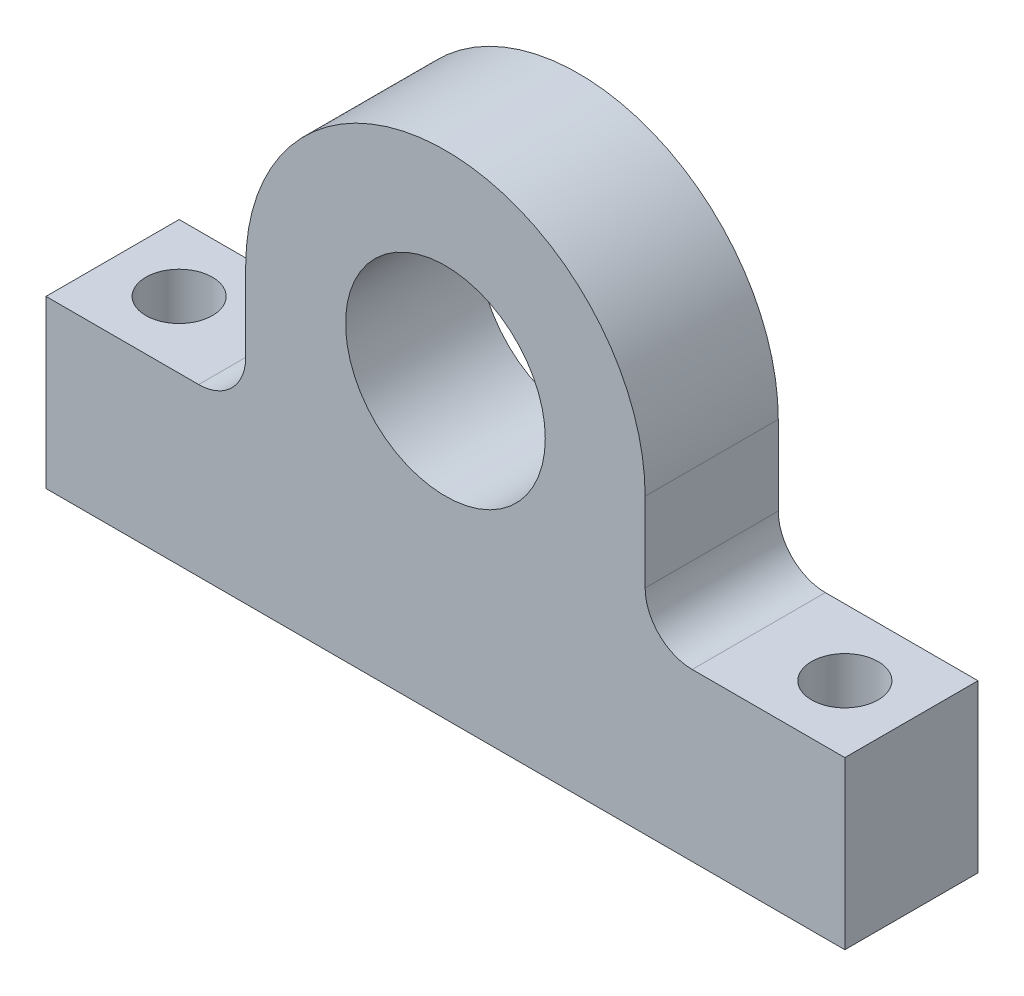
ISO-10303-21;
HEADER;
FILE_DESCRIPTION(('STEP AP214'),'2;1');
FILE_NAME('part.step','',(''),(''),'','','');
FILE_SCHEMA(('AUTOMOTIVE_DESIGN { 1 0 10303 214 1 1 1 1 }'));
ENDSEC;
DATA;
#1=APPLICATION_CONTEXT('core data for automotive mechanical design processes');
#2=APPLICATION_PROTOCOL_DEFINITION('international standard','automotive_design',2000,#1);
#3=PRODUCT_CONTEXT('',#1,'mechanical');
#4=PRODUCT('Part','Part','',(#3));
#5=PRODUCT_RELATED_PRODUCT_CATEGORY('part','',(#4));
#6=PRODUCT_DEFINITION_FORMATION('','',#4);
#7=PRODUCT_DEFINITION_CONTEXT('part definition',#1,'design');
#8=PRODUCT_DEFINITION('design','',#6,#7);
#9=PRODUCT_DEFINITION_SHAPE('','',#8);
#10=(LENGTH_UNIT() NAMED_UNIT(*) SI_UNIT(.MILLI.,.METRE.));
#11=(NAMED_UNIT(*) PLANE_ANGLE_UNIT() SI_UNIT($,.RADIAN.));
#12=(NAMED_UNIT(*) SI_UNIT($,.STERADIAN.) SOLID_ANGLE_UNIT());
#13=UNCERTAINTY_MEASURE_WITH_UNIT(LENGTH_MEASURE(1.E-05),#10,'distance_accuracy_value','');
#14=(GEOMETRIC_REPRESENTATION_CONTEXT(3) GLOBAL_UNCERTAINTY_ASSIGNED_CONTEXT((#13)) GLOBAL_UNIT_ASSIGNED_CONTEXT((#10,
#11,#12)) REPRESENTATION_CONTEXT('',''));
#15=CARTESIAN_POINT('',(0.,0.,0.));
#16=DIRECTION('',(0.,0.,1.));
#17=DIRECTION('',(1.,0.,0.));
#18=AXIS2_PLACEMENT_3D('',#15,#16,#17);
#19=CARTESIAN_POINT('',(-18.5355339059328,-1.46446609406749,10.));
#20=DIRECTION('',(0.,0.,-1.));
#21=DIRECTION('',(-1.,0.,0.));
#22=AXIS2_PLACEMENT_3D('',#19,#20,#21);
#23=PLANE('',#22);
#24=DIRECTION('',(0.,-1.,0.));
#25=VECTOR('',#24,1.);
#26=CARTESIAN_POINT('',(-30.,-10.,10.));
#27=LINE('',#26,#25);
#28=CARTESIAN_POINT('',(-30.,-5.,10.));
#29=VERTEX_POINT('',#28);
#30=CARTESIAN_POINT('',(-30.,-17.5,10.));
#31=VERTEX_POINT('',#30);
#32=EDGE_CURVE('E130',#29,#31,#27,.T.);
#33=ORIENTED_EDGE('',*,*,#32,.T.);
#34=DIRECTION('',(-1.,0.,0.));
#35=VECTOR('',#34,1.);
#36=CARTESIAN_POINT('',(-30.,-17.5,10.));
#37=LINE('',#36,#35);
#38=CARTESIAN_POINT('',(30.,-17.5,10.));
#39=VERTEX_POINT('',#38);
#40=EDGE_CURVE('E202',#39,#31,#37,.T.);
#41=ORIENTED_EDGE('',*,*,#40,.F.);
#42=DIRECTION('',(0.,1.,0.));
#43=VECTOR('',#42,1.);
#44=CARTESIAN_POINT('',(30.,-10.,10.));
#45=LINE('',#44,#43);
#46=CARTESIAN_POINT('',(30.,-5.,10.));
#47=VERTEX_POINT('',#46);
#48=EDGE_CURVE('E94',#39,#47,#45,.T.);
#49=ORIENTED_EDGE('',*,*,#48,.T.);
#50=DIRECTION('',(-1.,0.,0.));
#51=VECTOR('',#50,1.);
#52=CARTESIAN_POINT('',(30.,-5.,10.));
#53=LINE('',#52,#51);
#54=CARTESIAN_POINT('',(18.5355339059327,-5.,10.));
#55=VERTEX_POINT('',#54);
#56=EDGE_CURVE('E188',#47,#55,#53,.T.);
#57=ORIENTED_EDGE('',*,*,#56,.T.);
#58=CARTESIAN_POINT('',(18.5355339059327,-1.46446609406726,10.));
#59=DIRECTION('',(0.,0.,-1.));
#60=DIRECTION('',(1.,0.,0.));
#61=AXIS2_PLACEMENT_3D('',#58,#59,#60);
#62=CIRCLE('',#61,3.53553390593274);
#63=CARTESIAN_POINT('',(15.,-1.46446609406726,10.));
#64=VERTEX_POINT('',#63);
#65=EDGE_CURVE('E168',#55,#64,#62,.T.);
#66=ORIENTED_EDGE('',*,*,#65,.T.);
#67=DIRECTION('',(0.,1.,0.));
#68=VECTOR('',#67,1.);
#69=CARTESIAN_POINT('',(15.,-1.46446609406726,10.));
#70=LINE('',#69,#68);
#71=CARTESIAN_POINT('',(15.,4.5,10.));
#72=VERTEX_POINT('',#71);
#73=EDGE_CURVE('E184',#64,#72,#70,.T.);
#74=ORIENTED_EDGE('',*,*,#73,.T.);
#75=CARTESIAN_POINT('',(0.,4.5,10.));
#76=DIRECTION('',(0.,0.,1.));
#77=DIRECTION('',(1.,0.,0.));
#78=AXIS2_PLACEMENT_3D('',#75,#76,#77);
#79=CIRCLE('',#78,15.);
#80=CARTESIAN_POINT('',(-15.,4.5,10.));
#81=VERTEX_POINT('',#80);
#82=EDGE_CURVE('E116',#72,#81,#79,.T.);
#83=ORIENTED_EDGE('',*,*,#82,.T.);
#84=DIRECTION('',(0.,-1.,0.));
#85=VECTOR('',#84,1.);
#86=CARTESIAN_POINT('',(-15.,-1.46446609406749,10.));
#87=LINE('',#86,#85);
#88=CARTESIAN_POINT('',(-15.,-1.46446609406749,10.));
#89=VERTEX_POINT('',#88);
#90=EDGE_CURVE('E110',#81,#89,#87,.T.);
#91=ORIENTED_EDGE('',*,*,#90,.T.);
#92=CARTESIAN_POINT('',(-18.5355339059328,-1.46446609406749,10.));
#93=DIRECTION('',(0.,0.,-1.));
#94=DIRECTION('',(-1.,0.,0.));
#95=AXIS2_PLACEMENT_3D('',#92,#93,#94);
#96=CIRCLE('',#95,3.53553390593265);
#97=CARTESIAN_POINT('',(-18.5355339059328,-5.00000000000014,10.));
#98=VERTEX_POINT('',#97);
#99=EDGE_CURVE('E114',#89,#98,#96,.T.);
#100=ORIENTED_EDGE('',*,*,#99,.T.);
#101=DIRECTION('',(-1.,0.,0.));
#102=VECTOR('',#101,1.);
#103=CARTESIAN_POINT('',(-30.,-5.,10.));
#104=LINE('',#103,#102);
#105=EDGE_CURVE('E50',#98,#29,#104,.T.);
#106=ORIENTED_EDGE('',*,*,#105,.T.);
#107=EDGE_LOOP('',(#33,#41,#49,#57,#66,#74,#83,#91,#100,#106));
#108=FACE_BOUND('',#107,.T.);
#109=CARTESIAN_POINT('',(0.,4.5,10.));
#110=DIRECTION('',(0.,0.,1.));
#111=DIRECTION('',(1.,0.,0.));
#112=AXIS2_PLACEMENT_3D('',#109,#110,#111);
#113=CIRCLE('',#112,7.5);
#114=CARTESIAN_POINT('',(7.5,4.5,10.));
#115=VERTEX_POINT('',#114);
#116=EDGE_CURVE('E139',#115,#115,#113,.T.);
#117=ORIENTED_EDGE('',*,*,#116,.F.);
#118=EDGE_LOOP('',(#117));
#119=FACE_BOUND('',#118,.T.);
#120=ADVANCED_FACE('F33',(#108,#119),#23,.F.);
#121=CARTESIAN_POINT('',(-18.5355339059328,-1.46446609406749,0.));
#122=DIRECTION('',(0.,0.,-1.));
#123=DIRECTION('',(-1.,0.,0.));
#124=AXIS2_PLACEMENT_3D('',#121,#122,#123);
#125=PLANE('',#124);
#126=DIRECTION('',(0.,1.,0.));
#127=VECTOR('',#126,1.);
#128=CARTESIAN_POINT('',(30.,-10.,0.));
#129=LINE('',#128,#127);
#130=CARTESIAN_POINT('',(30.,-17.5,0.));
#131=VERTEX_POINT('',#130);
#132=CARTESIAN_POINT('',(30.,-5.,0.));
#133=VERTEX_POINT('',#132);
#134=EDGE_CURVE('E136',#131,#133,#129,.T.);
#135=ORIENTED_EDGE('',*,*,#134,.F.);
#136=DIRECTION('',(1.,0.,0.));
#137=VECTOR('',#136,1.);
#138=CARTESIAN_POINT('',(-30.,-17.5,0.));
#139=LINE('',#138,#137);
#140=CARTESIAN_POINT('',(-30.,-17.5,0.));
#141=VERTEX_POINT('',#140);
#142=EDGE_CURVE('E208',#141,#131,#139,.T.);
#143=ORIENTED_EDGE('',*,*,#142,.F.);
#144=DIRECTION('',(0.,-1.,0.));
#145=VECTOR('',#144,1.);
#146=CARTESIAN_POINT('',(-30.,-10.,0.));
#147=LINE('',#146,#145);
#148=CARTESIAN_POINT('',(-30.,-5.,0.));
#149=VERTEX_POINT('',#148);
#150=EDGE_CURVE('E150',#149,#141,#147,.T.);
#151=ORIENTED_EDGE('',*,*,#150,.F.);
#152=DIRECTION('',(-1.,0.,0.));
#153=VECTOR('',#152,1.);
#154=CARTESIAN_POINT('',(-30.,-5.,0.));
#155=LINE('',#154,#153);
#156=CARTESIAN_POINT('',(-18.5355339059328,-5.00000000000014,0.));
#157=VERTEX_POINT('',#156);
#158=EDGE_CURVE('E86',#157,#149,#155,.T.);
#159=ORIENTED_EDGE('',*,*,#158,.F.);
#160=CARTESIAN_POINT('',(-18.5355339059328,-1.46446609406749,0.));
#161=DIRECTION('',(0.,0.,-1.));
#162=DIRECTION('',(-1.,0.,0.));
#163=AXIS2_PLACEMENT_3D('',#160,#161,#162);
#164=CIRCLE('',#163,3.53553390593265);
#165=CARTESIAN_POINT('',(-15.,-1.46446609406749,0.));
#166=VERTEX_POINT('',#165);
#167=EDGE_CURVE('E80',#166,#157,#164,.T.);
#168=ORIENTED_EDGE('',*,*,#167,.F.);
#169=DIRECTION('',(0.,-1.,0.));
#170=VECTOR('',#169,1.);
#171=CARTESIAN_POINT('',(-15.,-1.46446609406749,0.));
#172=LINE('',#171,#170);
#173=CARTESIAN_POINT('',(-15.,4.5,0.));
#174=VERTEX_POINT('',#173);
#175=EDGE_CURVE('E124',#174,#166,#172,.T.);
#176=ORIENTED_EDGE('',*,*,#175,.F.);
#177=CARTESIAN_POINT('',(0.,4.5,0.));
#178=DIRECTION('',(0.,0.,1.));
#179=DIRECTION('',(1.,0.,0.));
#180=AXIS2_PLACEMENT_3D('',#177,#178,#179);
#181=CIRCLE('',#180,15.);
#182=CARTESIAN_POINT('',(15.,4.5,0.));
#183=VERTEX_POINT('',#182);
#184=EDGE_CURVE('E145',#183,#174,#181,.T.);
#185=ORIENTED_EDGE('',*,*,#184,.F.);
#186=DIRECTION('',(0.,1.,0.));
#187=VECTOR('',#186,1.);
#188=CARTESIAN_POINT('',(15.,-1.46446609406726,0.));
#189=LINE('',#188,#187);
#190=CARTESIAN_POINT('',(15.,-1.46446609406726,0.));
#191=VERTEX_POINT('',#190);
#192=EDGE_CURVE('E143',#191,#183,#189,.T.);
#193=ORIENTED_EDGE('',*,*,#192,.F.);
#194=CARTESIAN_POINT('',(18.5355339059327,-1.46446609406726,0.));
#195=DIRECTION('',(0.,0.,-1.));
#196=DIRECTION('',(1.,0.,0.));
#197=AXIS2_PLACEMENT_3D('',#194,#195,#196);
#198=CIRCLE('',#197,3.53553390593274);
#199=CARTESIAN_POINT('',(18.5355339059327,-5.,0.));
#200=VERTEX_POINT('',#199);
#201=EDGE_CURVE('E141',#200,#191,#198,.T.);
#202=ORIENTED_EDGE('',*,*,#201,.F.);
#203=DIRECTION('',(-1.,0.,0.));
#204=VECTOR('',#203,1.);
#205=CARTESIAN_POINT('',(30.,-5.,0.));
#206=LINE('',#205,#204);
#207=EDGE_CURVE('E138',#133,#200,#206,.T.);
#208=ORIENTED_EDGE('',*,*,#207,.F.);
#209=EDGE_LOOP('',(#135,#143,#151,#159,#168,#176,#185,#193,#202,#208));
#210=FACE_BOUND('',#209,.T.);
#211=CARTESIAN_POINT('',(0.,4.5,0.));
#212=DIRECTION('',(0.,0.,1.));
#213=DIRECTION('',(1.,0.,0.));
#214=AXIS2_PLACEMENT_3D('',#211,#212,#213);
#215=CIRCLE('',#214,7.5);
#216=CARTESIAN_POINT('',(7.5,4.5,0.));
#217=VERTEX_POINT('',#216);
#218=EDGE_CURVE('E191',#217,#217,#215,.T.);
#219=ORIENTED_EDGE('',*,*,#218,.T.);
#220=EDGE_LOOP('',(#219));
#221=FACE_BOUND('',#220,.T.);
#222=ADVANCED_FACE('F175',(#210,#221),#125,.T.);
#223=CARTESIAN_POINT('',(30.,-10.,10.));
#224=DIRECTION('',(-1.,0.,0.));
#225=DIRECTION('',(0.,0.,1.));
#226=AXIS2_PLACEMENT_3D('',#223,#224,#225);
#227=PLANE('',#226);
#228=ORIENTED_EDGE('',*,*,#134,.T.);
#229=DIRECTION('',(0.,0.,-1.));
#230=VECTOR('',#229,1.);
#231=CARTESIAN_POINT('',(30.,-5.,10.));
#232=LINE('',#231,#230);
#233=EDGE_CURVE('E11',#47,#133,#232,.T.);
#234=ORIENTED_EDGE('',*,*,#233,.F.);
#235=ORIENTED_EDGE('',*,*,#48,.F.);
#236=DIRECTION('',(0.,0.,1.));
#237=VECTOR('',#236,1.);
#238=CARTESIAN_POINT('',(30.,-17.5,10.));
#239=LINE('',#238,#237);
#240=EDGE_CURVE('E205',#131,#39,#239,.T.);
#241=ORIENTED_EDGE('',*,*,#240,.F.);
#242=EDGE_LOOP('',(#228,#234,#235,#241));
#243=FACE_BOUND('',#242,.T.);
#244=ADVANCED_FACE('F35',(#243),#227,.F.);
#245=CARTESIAN_POINT('',(30.,-5.,10.));
#246=DIRECTION('',(0.,-1.,0.));
#247=DIRECTION('',(1.,0.,0.));
#248=AXIS2_PLACEMENT_3D('',#245,#246,#247);
#249=PLANE('',#248);
#250=CARTESIAN_POINT('',(25.,-5.,5.));
#251=DIRECTION('',(0.,1.,0.));
#252=DIRECTION('',(0.,0.,-1.));
#253=AXIS2_PLACEMENT_3D('',#250,#251,#252);
#254=CIRCLE('',#253,2.5);
#255=CARTESIAN_POINT('',(25.,-5.,2.5));
#256=VERTEX_POINT('',#255);
#257=EDGE_CURVE('E199',#256,#256,#254,.T.);
#258=ORIENTED_EDGE('',*,*,#257,.F.);
#259=EDGE_LOOP('',(#258));
#260=FACE_BOUND('',#259,.T.);
#261=ORIENTED_EDGE('',*,*,#207,.T.);
#262=DIRECTION('',(0.,0.,-1.));
#263=VECTOR('',#262,1.);
#264=CARTESIAN_POINT('',(18.5355339059327,-5.,10.));
#265=LINE('',#264,#263);
#266=EDGE_CURVE('E42',#55,#200,#265,.T.);
#267=ORIENTED_EDGE('',*,*,#266,.F.);
#268=ORIENTED_EDGE('',*,*,#56,.F.);
#269=ORIENTED_EDGE('',*,*,#233,.T.);
#270=EDGE_LOOP('',(#261,#267,#268,#269));
#271=FACE_BOUND('',#270,.T.);
#272=ADVANCED_FACE('F262',(#260,#271),#249,.F.);
#273=CARTESIAN_POINT('',(18.5355339059327,-1.46446609406726,10.));
#274=DIRECTION('',(0.,0.,-1.));
#275=DIRECTION('',(-1.,0.,0.));
#276=AXIS2_PLACEMENT_3D('',#273,#274,#275);
#277=CYLINDRICAL_SURFACE('',#276,3.53553390593274);
#278=ORIENTED_EDGE('',*,*,#201,.T.);
#279=DIRECTION('',(0.,0.,-1.));
#280=VECTOR('',#279,1.);
#281=CARTESIAN_POINT('',(15.,-1.46446609406726,10.));
#282=LINE('',#281,#280);
#283=EDGE_CURVE('E159',#64,#191,#282,.T.);
#284=ORIENTED_EDGE('',*,*,#283,.F.);
#285=ORIENTED_EDGE('',*,*,#65,.F.);
#286=ORIENTED_EDGE('',*,*,#266,.T.);
#287=EDGE_LOOP('',(#278,#284,#285,#286));
#288=FACE_BOUND('',#287,.T.);
#289=ADVANCED_FACE('F166',(#288),#277,.F.);
#290=CARTESIAN_POINT('',(15.,-1.46446609406726,10.));
#291=DIRECTION('',(-1.,0.,0.));
#292=DIRECTION('',(0.,-1.,0.));
#293=AXIS2_PLACEMENT_3D('',#290,#291,#292);
#294=PLANE('',#293);
#295=ORIENTED_EDGE('',*,*,#192,.T.);
#296=DIRECTION('',(0.,0.,-1.));
#297=VECTOR('',#296,1.);
#298=CARTESIAN_POINT('',(15.,4.5,10.));
#299=LINE('',#298,#297);
#300=EDGE_CURVE('E156',#72,#183,#299,.T.);
#301=ORIENTED_EDGE('',*,*,#300,.F.);
#302=ORIENTED_EDGE('',*,*,#73,.F.);
#303=ORIENTED_EDGE('',*,*,#283,.T.);
#304=EDGE_LOOP('',(#295,#301,#302,#303));
#305=FACE_BOUND('',#304,.T.);
#306=ADVANCED_FACE('F180',(#305),#294,.F.);
#307=CARTESIAN_POINT('',(0.,4.5,10.));
#308=DIRECTION('',(0.,0.,-1.));
#309=DIRECTION('',(-1.,0.,0.));
#310=AXIS2_PLACEMENT_3D('',#307,#308,#309);
#311=CYLINDRICAL_SURFACE('',#310,15.);
#312=ORIENTED_EDGE('',*,*,#184,.T.);
#313=DIRECTION('',(0.,0.,-1.));
#314=VECTOR('',#313,1.);
#315=CARTESIAN_POINT('',(-15.,4.5,10.));
#316=LINE('',#315,#314);
#317=EDGE_CURVE('E125',#81,#174,#316,.T.);
#318=ORIENTED_EDGE('',*,*,#317,.F.);
#319=ORIENTED_EDGE('',*,*,#82,.F.);
#320=ORIENTED_EDGE('',*,*,#300,.T.);
#321=EDGE_LOOP('',(#312,#318,#319,#320));
#322=FACE_BOUND('',#321,.T.);
#323=ADVANCED_FACE('F183',(#322),#311,.T.);
#324=CARTESIAN_POINT('',(-15.,-1.46446609406749,10.));
#325=DIRECTION('',(1.,0.,0.));
#326=DIRECTION('',(0.,0.,-1.));
#327=AXIS2_PLACEMENT_3D('',#324,#325,#326);
#328=PLANE('',#327);
#329=ORIENTED_EDGE('',*,*,#175,.T.);
#330=DIRECTION('',(0.,0.,-1.));
#331=VECTOR('',#330,1.);
#332=CARTESIAN_POINT('',(-15.,-1.46446609406749,10.));
#333=LINE('',#332,#331);
#334=EDGE_CURVE('E121',#89,#166,#333,.T.);
#335=ORIENTED_EDGE('',*,*,#334,.F.);
#336=ORIENTED_EDGE('',*,*,#90,.F.);
#337=ORIENTED_EDGE('',*,*,#317,.T.);
#338=EDGE_LOOP('',(#329,#335,#336,#337));
#339=FACE_BOUND('',#338,.T.);
#340=ADVANCED_FACE('F122',(#339),#328,.F.);
#341=CARTESIAN_POINT('',(-18.5355339059328,-1.46446609406749,10.));
#342=DIRECTION('',(0.,0.,-1.));
#343=DIRECTION('',(-1.,0.,0.));
#344=AXIS2_PLACEMENT_3D('',#341,#342,#343);
#345=CYLINDRICAL_SURFACE('',#344,3.53553390593265);
#346=ORIENTED_EDGE('',*,*,#167,.T.);
#347=DIRECTION('',(0.,0.,-1.));
#348=VECTOR('',#347,1.);
#349=CARTESIAN_POINT('',(-18.5355339059328,-5.00000000000014,10.));
#350=LINE('',#349,#348);
#351=EDGE_CURVE('E126',#98,#157,#350,.T.);
#352=ORIENTED_EDGE('',*,*,#351,.F.);
#353=ORIENTED_EDGE('',*,*,#99,.F.);
#354=ORIENTED_EDGE('',*,*,#334,.T.);
#355=EDGE_LOOP('',(#346,#352,#353,#354));
#356=FACE_BOUND('',#355,.T.);
#357=ADVANCED_FACE('F128',(#356),#345,.F.);
#358=CARTESIAN_POINT('',(-30.,-5.,10.));
#359=DIRECTION('',(0.,-1.,0.));
#360=DIRECTION('',(0.,0.,-1.));
#361=AXIS2_PLACEMENT_3D('',#358,#359,#360);
#362=PLANE('',#361);
#363=CARTESIAN_POINT('',(-25.,-5.,5.));
#364=DIRECTION('',(0.,1.,0.));
#365=DIRECTION('',(0.,0.,1.));
#366=AXIS2_PLACEMENT_3D('',#363,#364,#365);
#367=CIRCLE('',#366,2.5);
#368=CARTESIAN_POINT('',(-25.,-5.,7.5));
#369=VERTEX_POINT('',#368);
#370=EDGE_CURVE('E194',#369,#369,#367,.T.);
#371=ORIENTED_EDGE('',*,*,#370,.F.);
#372=EDGE_LOOP('',(#371));
#373=FACE_BOUND('',#372,.T.);
#374=ORIENTED_EDGE('',*,*,#158,.T.);
#375=DIRECTION('',(0.,0.,-1.));
#376=VECTOR('',#375,1.);
#377=CARTESIAN_POINT('',(-30.,-5.,10.));
#378=LINE('',#377,#376);
#379=EDGE_CURVE('E135',#29,#149,#378,.T.);
#380=ORIENTED_EDGE('',*,*,#379,.F.);
#381=ORIENTED_EDGE('',*,*,#105,.F.);
#382=ORIENTED_EDGE('',*,*,#351,.T.);
#383=EDGE_LOOP('',(#374,#380,#381,#382));
#384=FACE_BOUND('',#383,.T.);
#385=ADVANCED_FACE('F248',(#373,#384),#362,.F.);
#386=CARTESIAN_POINT('',(-30.,-10.,10.));
#387=DIRECTION('',(1.,0.,0.));
#388=DIRECTION('',(0.,0.,-1.));
#389=AXIS2_PLACEMENT_3D('',#386,#387,#388);
#390=PLANE('',#389);
#391=ORIENTED_EDGE('',*,*,#150,.T.);
#392=DIRECTION('',(0.,0.,-1.));
#393=VECTOR('',#392,1.);
#394=CARTESIAN_POINT('',(-30.,-17.5,10.));
#395=LINE('',#394,#393);
#396=EDGE_CURVE('E211',#31,#141,#395,.T.);
#397=ORIENTED_EDGE('',*,*,#396,.F.);
#398=ORIENTED_EDGE('',*,*,#32,.F.);
#399=ORIENTED_EDGE('',*,*,#379,.T.);
#400=EDGE_LOOP('',(#391,#397,#398,#399));
#401=FACE_BOUND('',#400,.T.);
#402=ADVANCED_FACE('F245',(#401),#390,.F.);
#403=CARTESIAN_POINT('',(0.,4.5,10.));
#404=DIRECTION('',(0.,0.,-1.));
#405=DIRECTION('',(-1.,0.,0.));
#406=AXIS2_PLACEMENT_3D('',#403,#404,#405);
#407=CYLINDRICAL_SURFACE('',#406,7.5);
#408=ORIENTED_EDGE('',*,*,#116,.T.);
#409=EDGE_LOOP('',(#408));
#410=FACE_BOUND('',#409,.T.);
#411=ORIENTED_EDGE('',*,*,#218,.F.);
#412=EDGE_LOOP('',(#411));
#413=FACE_BOUND('',#412,.T.);
#414=ADVANCED_FACE('F242',(#410,#413),#407,.F.);
#415=CARTESIAN_POINT('',(-25.,-15.,5.));
#416=DIRECTION('',(0.,1.,0.));
#417=DIRECTION('',(0.,0.,1.));
#418=AXIS2_PLACEMENT_3D('',#415,#416,#417);
#419=CYLINDRICAL_SURFACE('',#418,2.5);
#420=ORIENTED_EDGE('',*,*,#370,.T.);
#421=EDGE_LOOP('',(#420));
#422=FACE_BOUND('',#421,.T.);
#423=CARTESIAN_POINT('',(-25.,-17.5,5.));
#424=DIRECTION('',(0.,-1.,0.));
#425=DIRECTION('',(0.,0.,-1.));
#426=AXIS2_PLACEMENT_3D('',#423,#424,#425);
#427=CIRCLE('',#426,2.5);
#428=CARTESIAN_POINT('',(-25.,-17.5,2.5));
#429=VERTEX_POINT('',#428);
#430=EDGE_CURVE('E214',#429,#429,#427,.T.);
#431=ORIENTED_EDGE('',*,*,#430,.T.);
#432=EDGE_LOOP('',(#431));
#433=FACE_BOUND('',#432,.T.);
#434=ADVANCED_FACE('F230',(#422,#433),#419,.F.);
#435=CARTESIAN_POINT('',(25.,-15.,5.));
#436=DIRECTION('',(0.,1.,0.));
#437=DIRECTION('',(0.,0.,1.));
#438=AXIS2_PLACEMENT_3D('',#435,#436,#437);
#439=CYLINDRICAL_SURFACE('',#438,2.5);
#440=ORIENTED_EDGE('',*,*,#257,.T.);
#441=EDGE_LOOP('',(#440));
#442=FACE_BOUND('',#441,.T.);
#443=CARTESIAN_POINT('',(25.,-17.5,5.));
#444=DIRECTION('',(0.,-1.,0.));
#445=DIRECTION('',(0.,0.,-1.));
#446=AXIS2_PLACEMENT_3D('',#443,#444,#445);
#447=CIRCLE('',#446,2.5);
#448=CARTESIAN_POINT('',(25.,-17.5,2.5));
#449=VERTEX_POINT('',#448);
#450=EDGE_CURVE('E217',#449,#449,#447,.T.);
#451=ORIENTED_EDGE('',*,*,#450,.T.);
#452=EDGE_LOOP('',(#451));
#453=FACE_BOUND('',#452,.T.);
#454=ADVANCED_FACE('F221',(#442,#453),#439,.F.);
#455=CARTESIAN_POINT('',(0.,-17.5,0.));
#456=DIRECTION('',(0.,-1.,0.));
#457=DIRECTION('',(0.,0.,-1.));
#458=AXIS2_PLACEMENT_3D('',#455,#456,#457);
#459=PLANE('',#458);
#460=ORIENTED_EDGE('',*,*,#430,.F.);
#461=EDGE_LOOP('',(#460));
#462=FACE_BOUND('',#461,.T.);
#463=ORIENTED_EDGE('',*,*,#396,.T.);
#464=ORIENTED_EDGE('',*,*,#142,.T.);
#465=ORIENTED_EDGE('',*,*,#240,.T.);
#466=ORIENTED_EDGE('',*,*,#40,.T.);
#467=EDGE_LOOP('',(#463,#464,#465,#466));
#468=FACE_BOUND('',#467,.T.);
#469=ORIENTED_EDGE('',*,*,#450,.F.);
#470=EDGE_LOOP('',(#469));
#471=FACE_BOUND('',#470,.T.);
#472=ADVANCED_FACE('F223',(#462,#468,#471),#459,.T.);
#473=CLOSED_SHELL('',(#120,#222,#244,#272,#289,#306,#323,#340,#357,#385,#402,#414,#434,#454,#472));
#474=MANIFOLD_SOLID_BREP('B2',#473);
#475=ADVANCED_BREP_SHAPE_REPRESENTATION('',(#18,#474),#14);
#476=SHAPE_DEFINITION_REPRESENTATION(#9,#475);
ENDSEC;
END-ISO-10303-21;
